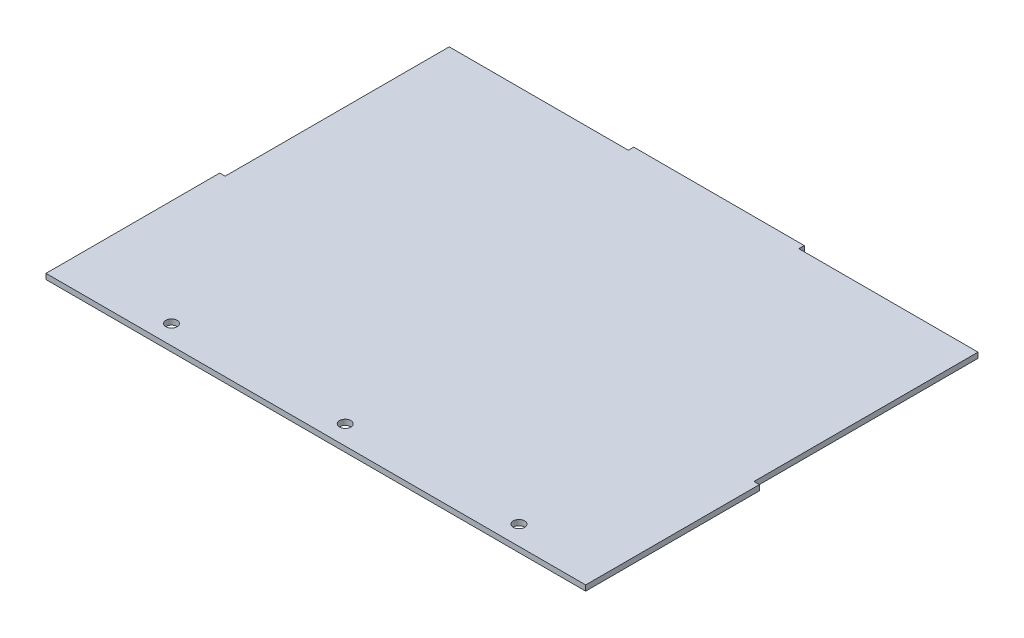
ISO-10303-21;
HEADER;
FILE_DESCRIPTION(('STEP AP214'),'2;1');
FILE_NAME('part.step','',(''),(''),'','','');
FILE_SCHEMA(('AUTOMOTIVE_DESIGN { 1 0 10303 214 1 1 1 1 }'));
ENDSEC;
DATA;
#1=APPLICATION_CONTEXT('core data for automotive mechanical design processes');
#2=APPLICATION_PROTOCOL_DEFINITION('international standard','automotive_design',2000,#1);
#3=PRODUCT_CONTEXT('',#1,'mechanical');
#4=PRODUCT('Part','Part','',(#3));
#5=PRODUCT_RELATED_PRODUCT_CATEGORY('part','',(#4));
#6=PRODUCT_DEFINITION_FORMATION('','',#4);
#7=PRODUCT_DEFINITION_CONTEXT('part definition',#1,'design');
#8=PRODUCT_DEFINITION('design','',#6,#7);
#9=PRODUCT_DEFINITION_SHAPE('','',#8);
#10=(LENGTH_UNIT() NAMED_UNIT(*) SI_UNIT(.MILLI.,.METRE.));
#11=(NAMED_UNIT(*) PLANE_ANGLE_UNIT() SI_UNIT($,.RADIAN.));
#12=(NAMED_UNIT(*) SI_UNIT($,.STERADIAN.) SOLID_ANGLE_UNIT());
#13=UNCERTAINTY_MEASURE_WITH_UNIT(LENGTH_MEASURE(1.E-05),#10,'distance_accuracy_value','');
#14=(GEOMETRIC_REPRESENTATION_CONTEXT(3) GLOBAL_UNCERTAINTY_ASSIGNED_CONTEXT((#13)) GLOBAL_UNIT_ASSIGNED_CONTEXT((#10,
#11,#12)) REPRESENTATION_CONTEXT('',''));
#15=CARTESIAN_POINT('',(0.,0.,0.));
#16=DIRECTION('',(0.,0.,1.));
#17=DIRECTION('',(1.,0.,0.));
#18=AXIS2_PLACEMENT_3D('',#15,#16,#17);
#19=CARTESIAN_POINT('',(0.,0.,0.));
#20=DIRECTION('',(0.,0.,-1.));
#21=DIRECTION('',(-1.,0.,0.));
#22=AXIS2_PLACEMENT_3D('',#19,#20,#21);
#23=PLANE('',#22);
#24=DIRECTION('',(0.,1.,0.));
#25=VECTOR('',#24,1.);
#26=CARTESIAN_POINT('',(-49.84,1.5875,0.));
#27=LINE('',#26,#25);
#28=CARTESIAN_POINT('',(-49.84,-1.5875,0.));
#29=VERTEX_POINT('',#28);
#30=CARTESIAN_POINT('',(-49.84,1.5875,0.));
#31=VERTEX_POINT('',#30);
#32=EDGE_CURVE('E53',#29,#31,#27,.T.);
#33=ORIENTED_EDGE('',*,*,#32,.F.);
#34=DIRECTION('',(1.,0.,0.));
#35=VECTOR('',#34,1.);
#36=CARTESIAN_POINT('',(-157.79,-1.5875,0.));
#37=LINE('',#36,#35);
#38=CARTESIAN_POINT('',(-154.615,-1.5875,0.));
#39=VERTEX_POINT('',#38);
#40=EDGE_CURVE('E208',#39,#29,#37,.T.);
#41=ORIENTED_EDGE('',*,*,#40,.F.);
#42=DIRECTION('',(0.,1.,0.));
#43=VECTOR('',#42,1.);
#44=CARTESIAN_POINT('',(-154.615,-1.5875,0.));
#45=LINE('',#44,#43);
#46=CARTESIAN_POINT('',(-154.615,1.5875,0.));
#47=VERTEX_POINT('',#46);
#48=EDGE_CURVE('E192',#39,#47,#45,.T.);
#49=ORIENTED_EDGE('',*,*,#48,.T.);
#50=DIRECTION('',(-1.,0.,0.));
#51=VECTOR('',#50,1.);
#52=CARTESIAN_POINT('',(-157.79,1.5875,0.));
#53=LINE('',#52,#51);
#54=EDGE_CURVE('E58',#31,#47,#53,.T.);
#55=ORIENTED_EDGE('',*,*,#54,.F.);
#56=EDGE_LOOP('',(#33,#41,#49,#55));
#57=FACE_BOUND('',#56,.T.);
#58=ADVANCED_FACE('F38',(#57),#23,.T.);
#59=CARTESIAN_POINT('',(-95.7046067812089,1.5875,221.308349999902));
#60=DIRECTION('',(0.,-1.,0.));
#61=DIRECTION('',(0.,0.,-1.));
#62=AXIS2_PLACEMENT_3D('',#59,#60,#61);
#63=CYLINDRICAL_SURFACE('',#62,3.302);
#64=CARTESIAN_POINT('',(-95.7046067812089,1.5875,221.308349999902));
#65=DIRECTION('',(0.,-1.,0.));
#66=DIRECTION('',(0.,0.,-1.));
#67=AXIS2_PLACEMENT_3D('',#64,#65,#66);
#68=CIRCLE('',#67,3.302);
#69=CARTESIAN_POINT('',(-95.7046067812089,1.5875,218.006349999902));
#70=VERTEX_POINT('',#69);
#71=EDGE_CURVE('E46',#70,#70,#68,.T.);
#72=ORIENTED_EDGE('',*,*,#71,.F.);
#73=EDGE_LOOP('',(#72));
#74=FACE_BOUND('',#73,.T.);
#75=CARTESIAN_POINT('',(-95.7046067812089,-1.5875,221.308349999902));
#76=DIRECTION('',(0.,-1.,0.));
#77=DIRECTION('',(0.,0.,-1.));
#78=AXIS2_PLACEMENT_3D('',#75,#76,#77);
#79=CIRCLE('',#78,3.302);
#80=CARTESIAN_POINT('',(-95.7046067812089,-1.5875,218.006349999902));
#81=VERTEX_POINT('',#80);
#82=EDGE_CURVE('E11',#81,#81,#79,.T.);
#83=ORIENTED_EDGE('',*,*,#82,.T.);
#84=EDGE_LOOP('',(#83));
#85=FACE_BOUND('',#84,.T.);
#86=ADVANCED_FACE('F40',(#74,#85),#63,.F.);
#87=CARTESIAN_POINT('',(157.79,-1.5875,232.600000128));
#88=DIRECTION('',(-1.,0.,0.));
#89=DIRECTION('',(0.,0.,1.));
#90=AXIS2_PLACEMENT_3D('',#87,#88,#89);
#91=PLANE('',#90);
#92=DIRECTION('',(0.,1.,0.));
#93=VECTOR('',#92,1.);
#94=CARTESIAN_POINT('',(157.79,-1.5875,130.999992));
#95=LINE('',#94,#93);
#96=CARTESIAN_POINT('',(157.79,-1.5875,130.999992));
#97=VERTEX_POINT('',#96);
#98=CARTESIAN_POINT('',(157.79,1.5875,130.999992));
#99=VERTEX_POINT('',#98);
#100=EDGE_CURVE('E174',#97,#99,#95,.T.);
#101=ORIENTED_EDGE('',*,*,#100,.T.);
#102=DIRECTION('',(0.,0.,-1.));
#103=VECTOR('',#102,1.);
#104=CARTESIAN_POINT('',(157.79,1.5875,232.600000128));
#105=LINE('',#104,#103);
#106=CARTESIAN_POINT('',(157.79,1.5875,232.600000128));
#107=VERTEX_POINT('',#106);
#108=EDGE_CURVE('E227',#107,#99,#105,.T.);
#109=ORIENTED_EDGE('',*,*,#108,.F.);
#110=DIRECTION('',(0.,1.,0.));
#111=VECTOR('',#110,1.);
#112=CARTESIAN_POINT('',(157.79,-1.5875,232.600000128));
#113=LINE('',#112,#111);
#114=CARTESIAN_POINT('',(157.79,-1.5875,232.600000128));
#115=VERTEX_POINT('',#114);
#116=EDGE_CURVE('E204',#115,#107,#113,.T.);
#117=ORIENTED_EDGE('',*,*,#116,.F.);
#118=DIRECTION('',(0.,0.,-1.));
#119=VECTOR('',#118,1.);
#120=CARTESIAN_POINT('',(157.79,-1.5875,232.600000128));
#121=LINE('',#120,#119);
#122=EDGE_CURVE('E214',#115,#97,#121,.T.);
#123=ORIENTED_EDGE('',*,*,#122,.T.);
#124=EDGE_LOOP('',(#101,#109,#117,#123));
#125=FACE_BOUND('',#124,.T.);
#126=ADVANCED_FACE('F234',(#125),#91,.F.);
#127=CARTESIAN_POINT('',(-157.79,1.5875,232.600000128));
#128=DIRECTION('',(0.,-1.,0.));
#129=DIRECTION('',(0.,0.,-1.));
#130=AXIS2_PLACEMENT_3D('',#127,#128,#129);
#131=PLANE('',#130);
#132=CARTESIAN_POINT('',(5.89539321879114,1.5875,221.308349999902));
#133=DIRECTION('',(0.,-1.,0.));
#134=DIRECTION('',(0.,0.,-1.));
#135=AXIS2_PLACEMENT_3D('',#132,#133,#134);
#136=CIRCLE('',#135,3.302);
#137=CARTESIAN_POINT('',(5.89539321879114,1.5875,218.006349999902));
#138=VERTEX_POINT('',#137);
#139=EDGE_CURVE('E151',#138,#138,#136,.T.);
#140=ORIENTED_EDGE('',*,*,#139,.T.);
#141=EDGE_LOOP('',(#140));
#142=FACE_BOUND('',#141,.T.);
#143=CARTESIAN_POINT('',(107.495393218791,1.5875,221.308349999902));
#144=DIRECTION('',(0.,-1.,0.));
#145=DIRECTION('',(0.,0.,-1.));
#146=AXIS2_PLACEMENT_3D('',#143,#144,#145);
#147=CIRCLE('',#146,3.302);
#148=CARTESIAN_POINT('',(107.495393218791,1.5875,218.006349999902));
#149=VERTEX_POINT('',#148);
#150=EDGE_CURVE('E163',#149,#149,#147,.T.);
#151=ORIENTED_EDGE('',*,*,#150,.T.);
#152=EDGE_LOOP('',(#151));
#153=FACE_BOUND('',#152,.T.);
#154=DIRECTION('',(1.,0.,0.));
#155=VECTOR('',#154,1.);
#156=CARTESIAN_POINT('',(-157.79,1.5875,130.999992));
#157=LINE('',#156,#155);
#158=CARTESIAN_POINT('',(154.615,1.5875,130.999992));
#159=VERTEX_POINT('',#158);
#160=EDGE_CURVE('E183',#159,#99,#157,.T.);
#161=ORIENTED_EDGE('',*,*,#160,.F.);
#162=DIRECTION('',(0.,0.,1.));
#163=VECTOR('',#162,1.);
#164=CARTESIAN_POINT('',(154.615,1.5875,232.600000128));
#165=LINE('',#164,#163);
#166=CARTESIAN_POINT('',(154.615,1.5875,0.));
#167=VERTEX_POINT('',#166);
#168=EDGE_CURVE('E177',#167,#159,#165,.T.);
#169=ORIENTED_EDGE('',*,*,#168,.F.);
#170=CARTESIAN_POINT('',(49.84,1.5875,0.));
#171=VERTEX_POINT('',#170);
#172=EDGE_CURVE('E215',#167,#171,#53,.T.);
#173=ORIENTED_EDGE('',*,*,#172,.T.);
#174=DIRECTION('',(0.,0.,1.));
#175=VECTOR('',#174,1.);
#176=CARTESIAN_POINT('',(49.84,1.5875,-3.175));
#177=LINE('',#176,#175);
#178=CARTESIAN_POINT('',(49.84,1.5875,-3.175));
#179=VERTEX_POINT('',#178);
#180=EDGE_CURVE('E135',#179,#171,#177,.T.);
#181=ORIENTED_EDGE('',*,*,#180,.F.);
#182=DIRECTION('',(1.,0.,0.));
#183=VECTOR('',#182,1.);
#184=CARTESIAN_POINT('',(-49.84,1.5875,-3.175));
#185=LINE('',#184,#183);
#186=CARTESIAN_POINT('',(-49.84,1.5875,-3.175));
#187=VERTEX_POINT('',#186);
#188=EDGE_CURVE('E126',#187,#179,#185,.T.);
#189=ORIENTED_EDGE('',*,*,#188,.F.);
#190=DIRECTION('',(0.,0.,1.));
#191=VECTOR('',#190,1.);
#192=CARTESIAN_POINT('',(-49.84,1.5875,-3.175));
#193=LINE('',#192,#191);
#194=EDGE_CURVE('E132',#187,#31,#193,.T.);
#195=ORIENTED_EDGE('',*,*,#194,.T.);
#196=ORIENTED_EDGE('',*,*,#54,.T.);
#197=DIRECTION('',(0.,0.,1.));
#198=VECTOR('',#197,1.);
#199=CARTESIAN_POINT('',(-154.615,1.5875,232.600000128));
#200=LINE('',#199,#198);
#201=CARTESIAN_POINT('',(-154.615,1.5875,130.999992));
#202=VERTEX_POINT('',#201);
#203=EDGE_CURVE('E194',#47,#202,#200,.T.);
#204=ORIENTED_EDGE('',*,*,#203,.T.);
#205=DIRECTION('',(-1.,0.,0.));
#206=VECTOR('',#205,1.);
#207=CARTESIAN_POINT('',(-157.79,1.5875,130.999992));
#208=LINE('',#207,#206);
#209=CARTESIAN_POINT('',(-157.79,1.5875,130.999992));
#210=VERTEX_POINT('',#209);
#211=EDGE_CURVE('E201',#202,#210,#208,.T.);
#212=ORIENTED_EDGE('',*,*,#211,.T.);
#213=DIRECTION('',(0.,0.,-1.));
#214=VECTOR('',#213,1.);
#215=CARTESIAN_POINT('',(-157.79,1.5875,232.600000128));
#216=LINE('',#215,#214);
#217=CARTESIAN_POINT('',(-157.79,1.5875,232.600000128));
#218=VERTEX_POINT('',#217);
#219=EDGE_CURVE('E224',#218,#210,#216,.T.);
#220=ORIENTED_EDGE('',*,*,#219,.F.);
#221=DIRECTION('',(-1.,0.,0.));
#222=VECTOR('',#221,1.);
#223=CARTESIAN_POINT('',(-157.79,1.5875,232.600000128));
#224=LINE('',#223,#222);
#225=EDGE_CURVE('E207',#107,#218,#224,.T.);
#226=ORIENTED_EDGE('',*,*,#225,.F.);
#227=ORIENTED_EDGE('',*,*,#108,.T.);
#228=EDGE_LOOP('',(#161,#169,#173,#181,#189,#195,#196,#204,#212,#220,#226,#227));
#229=FACE_BOUND('',#228,.T.);
#230=ORIENTED_EDGE('',*,*,#71,.T.);
#231=EDGE_LOOP('',(#230));
#232=FACE_BOUND('',#231,.T.);
#233=ADVANCED_FACE('F129',(#142,#153,#229,#232),#131,.F.);
#234=CARTESIAN_POINT('',(-157.79,-1.5875,232.600000128));
#235=DIRECTION('',(0.,1.,0.));
#236=DIRECTION('',(0.,0.,1.));
#237=AXIS2_PLACEMENT_3D('',#234,#235,#236);
#238=PLANE('',#237);
#239=CARTESIAN_POINT('',(5.89539321879114,-1.5875,221.308349999902));
#240=DIRECTION('',(0.,-1.,0.));
#241=DIRECTION('',(0.,0.,-1.));
#242=AXIS2_PLACEMENT_3D('',#239,#240,#241);
#243=CIRCLE('',#242,3.302);
#244=CARTESIAN_POINT('',(5.89539321879114,-1.5875,218.006349999902));
#245=VERTEX_POINT('',#244);
#246=EDGE_CURVE('E154',#245,#245,#243,.T.);
#247=ORIENTED_EDGE('',*,*,#246,.F.);
#248=EDGE_LOOP('',(#247));
#249=FACE_BOUND('',#248,.T.);
#250=CARTESIAN_POINT('',(107.495393218791,-1.5875,221.308349999902));
#251=DIRECTION('',(0.,-1.,0.));
#252=DIRECTION('',(0.,0.,-1.));
#253=AXIS2_PLACEMENT_3D('',#250,#251,#252);
#254=CIRCLE('',#253,3.302);
#255=CARTESIAN_POINT('',(107.495393218791,-1.5875,218.006349999902));
#256=VERTEX_POINT('',#255);
#257=EDGE_CURVE('E162',#256,#256,#254,.T.);
#258=ORIENTED_EDGE('',*,*,#257,.F.);
#259=EDGE_LOOP('',(#258));
#260=FACE_BOUND('',#259,.T.);
#261=DIRECTION('',(-1.,0.,0.));
#262=VECTOR('',#261,1.);
#263=CARTESIAN_POINT('',(157.79,-1.5875,130.999992));
#264=LINE('',#263,#262);
#265=CARTESIAN_POINT('',(154.615,-1.5875,130.999992));
#266=VERTEX_POINT('',#265);
#267=EDGE_CURVE('E171',#97,#266,#264,.T.);
#268=ORIENTED_EDGE('',*,*,#267,.F.);
#269=ORIENTED_EDGE('',*,*,#122,.F.);
#270=DIRECTION('',(1.,0.,0.));
#271=VECTOR('',#270,1.);
#272=CARTESIAN_POINT('',(-157.79,-1.5875,232.600000128));
#273=LINE('',#272,#271);
#274=CARTESIAN_POINT('',(-157.79,-1.5875,232.600000128));
#275=VERTEX_POINT('',#274);
#276=EDGE_CURVE('E212',#275,#115,#273,.T.);
#277=ORIENTED_EDGE('',*,*,#276,.F.);
#278=DIRECTION('',(0.,0.,-1.));
#279=VECTOR('',#278,1.);
#280=CARTESIAN_POINT('',(-157.79,-1.5875,232.600000128));
#281=LINE('',#280,#279);
#282=CARTESIAN_POINT('',(-157.79,-1.5875,130.999992));
#283=VERTEX_POINT('',#282);
#284=EDGE_CURVE('E221',#275,#283,#281,.T.);
#285=ORIENTED_EDGE('',*,*,#284,.T.);
#286=DIRECTION('',(1.,0.,0.));
#287=VECTOR('',#286,1.);
#288=CARTESIAN_POINT('',(-157.79,-1.5875,130.999992));
#289=LINE('',#288,#287);
#290=CARTESIAN_POINT('',(-154.615,-1.5875,130.999992));
#291=VERTEX_POINT('',#290);
#292=EDGE_CURVE('E185',#283,#291,#289,.T.);
#293=ORIENTED_EDGE('',*,*,#292,.T.);
#294=DIRECTION('',(0.,0.,-1.));
#295=VECTOR('',#294,1.);
#296=CARTESIAN_POINT('',(-154.615,-1.5875,0.));
#297=LINE('',#296,#295);
#298=EDGE_CURVE('E188',#291,#39,#297,.T.);
#299=ORIENTED_EDGE('',*,*,#298,.T.);
#300=ORIENTED_EDGE('',*,*,#40,.T.);
#301=DIRECTION('',(0.,0.,1.));
#302=VECTOR('',#301,1.);
#303=CARTESIAN_POINT('',(-49.84,-1.5875,-3.175));
#304=LINE('',#303,#302);
#305=CARTESIAN_POINT('',(-49.84,-1.5875,-3.175));
#306=VERTEX_POINT('',#305);
#307=EDGE_CURVE('E445',#306,#29,#304,.T.);
#308=ORIENTED_EDGE('',*,*,#307,.F.);
#309=DIRECTION('',(-1.,0.,0.));
#310=VECTOR('',#309,1.);
#311=CARTESIAN_POINT('',(-49.84,-1.5875,-3.175));
#312=LINE('',#311,#310);
#313=CARTESIAN_POINT('',(49.84,-1.5875,-3.175));
#314=VERTEX_POINT('',#313);
#315=EDGE_CURVE('E144',#314,#306,#312,.T.);
#316=ORIENTED_EDGE('',*,*,#315,.F.);
#317=DIRECTION('',(0.,0.,1.));
#318=VECTOR('',#317,1.);
#319=CARTESIAN_POINT('',(49.84,-1.5875,-3.175));
#320=LINE('',#319,#318);
#321=CARTESIAN_POINT('',(49.84,-1.5875,0.));
#322=VERTEX_POINT('',#321);
#323=EDGE_CURVE('E156',#314,#322,#320,.T.);
#324=ORIENTED_EDGE('',*,*,#323,.T.);
#325=CARTESIAN_POINT('',(154.615,-1.5875,0.));
#326=VERTEX_POINT('',#325);
#327=EDGE_CURVE('E217',#322,#326,#37,.T.);
#328=ORIENTED_EDGE('',*,*,#327,.T.);
#329=DIRECTION('',(0.,0.,-1.));
#330=VECTOR('',#329,1.);
#331=CARTESIAN_POINT('',(154.615,-1.5875,0.));
#332=LINE('',#331,#330);
#333=EDGE_CURVE('E166',#266,#326,#332,.T.);
#334=ORIENTED_EDGE('',*,*,#333,.F.);
#335=EDGE_LOOP('',(#268,#269,#277,#285,#293,#299,#300,#308,#316,#324,#328,#334));
#336=FACE_BOUND('',#335,.T.);
#337=ORIENTED_EDGE('',*,*,#82,.F.);
#338=EDGE_LOOP('',(#337));
#339=FACE_BOUND('',#338,.T.);
#340=ADVANCED_FACE('F237',(#249,#260,#336,#339),#238,.F.);
#341=DIRECTION('',(0.,-1.,0.));
#342=VECTOR('',#341,1.);
#343=CARTESIAN_POINT('',(49.84,1.5875,0.));
#344=LINE('',#343,#342);
#345=EDGE_CURVE('E148',#171,#322,#344,.T.);
#346=ORIENTED_EDGE('',*,*,#345,.F.);
#347=ORIENTED_EDGE('',*,*,#172,.F.);
#348=DIRECTION('',(0.,1.,0.));
#349=VECTOR('',#348,1.);
#350=CARTESIAN_POINT('',(154.615,-1.5875,0.));
#351=LINE('',#350,#349);
#352=EDGE_CURVE('E173',#326,#167,#351,.T.);
#353=ORIENTED_EDGE('',*,*,#352,.F.);
#354=ORIENTED_EDGE('',*,*,#327,.F.);
#355=EDGE_LOOP('',(#346,#347,#353,#354));
#356=FACE_BOUND('',#355,.T.);
#357=ADVANCED_FACE('F239',(#356),#23,.T.);
#358=CARTESIAN_POINT('',(-157.79,-1.5875,232.600000128));
#359=DIRECTION('',(1.,0.,0.));
#360=DIRECTION('',(0.,0.,-1.));
#361=AXIS2_PLACEMENT_3D('',#358,#359,#360);
#362=PLANE('',#361);
#363=ORIENTED_EDGE('',*,*,#219,.T.);
#364=DIRECTION('',(0.,1.,0.));
#365=VECTOR('',#364,1.);
#366=CARTESIAN_POINT('',(-157.79,-1.5875,130.999992));
#367=LINE('',#366,#365);
#368=EDGE_CURVE('E191',#283,#210,#367,.T.);
#369=ORIENTED_EDGE('',*,*,#368,.F.);
#370=ORIENTED_EDGE('',*,*,#284,.F.);
#371=DIRECTION('',(0.,-1.,0.));
#372=VECTOR('',#371,1.);
#373=CARTESIAN_POINT('',(-157.79,-1.5875,232.600000128));
#374=LINE('',#373,#372);
#375=EDGE_CURVE('E210',#218,#275,#374,.T.);
#376=ORIENTED_EDGE('',*,*,#375,.F.);
#377=EDGE_LOOP('',(#363,#369,#370,#376));
#378=FACE_BOUND('',#377,.T.);
#379=ADVANCED_FACE('F246',(#378),#362,.F.);
#380=CARTESIAN_POINT('',(0.,0.,232.600000128));
#381=DIRECTION('',(0.,0.,-1.));
#382=DIRECTION('',(-1.,0.,0.));
#383=AXIS2_PLACEMENT_3D('',#380,#381,#382);
#384=PLANE('',#383);
#385=ORIENTED_EDGE('',*,*,#116,.T.);
#386=ORIENTED_EDGE('',*,*,#225,.T.);
#387=ORIENTED_EDGE('',*,*,#375,.T.);
#388=ORIENTED_EDGE('',*,*,#276,.T.);
#389=EDGE_LOOP('',(#385,#386,#387,#388));
#390=FACE_BOUND('',#389,.T.);
#391=ADVANCED_FACE('F258',(#390),#384,.F.);
#392=CARTESIAN_POINT('',(-157.79,-1.5875,130.999992));
#393=DIRECTION('',(0.,0.,1.));
#394=DIRECTION('',(1.,0.,0.));
#395=AXIS2_PLACEMENT_3D('',#392,#393,#394);
#396=PLANE('',#395);
#397=DIRECTION('',(0.,1.,0.));
#398=VECTOR('',#397,1.);
#399=CARTESIAN_POINT('',(-154.615,-1.5875,130.999992));
#400=LINE('',#399,#398);
#401=EDGE_CURVE('E195',#291,#202,#400,.T.);
#402=ORIENTED_EDGE('',*,*,#401,.F.);
#403=ORIENTED_EDGE('',*,*,#292,.F.);
#404=ORIENTED_EDGE('',*,*,#368,.T.);
#405=ORIENTED_EDGE('',*,*,#211,.F.);
#406=EDGE_LOOP('',(#402,#403,#404,#405));
#407=FACE_BOUND('',#406,.T.);
#408=ADVANCED_FACE('F261',(#407),#396,.F.);
#409=CARTESIAN_POINT('',(-154.615,-1.5875,0.));
#410=DIRECTION('',(1.,0.,0.));
#411=DIRECTION('',(0.,0.,-1.));
#412=AXIS2_PLACEMENT_3D('',#409,#410,#411);
#413=PLANE('',#412);
#414=ORIENTED_EDGE('',*,*,#48,.F.);
#415=ORIENTED_EDGE('',*,*,#298,.F.);
#416=ORIENTED_EDGE('',*,*,#401,.T.);
#417=ORIENTED_EDGE('',*,*,#203,.F.);
#418=EDGE_LOOP('',(#414,#415,#416,#417));
#419=FACE_BOUND('',#418,.T.);
#420=ADVANCED_FACE('F265',(#419),#413,.F.);
#421=CARTESIAN_POINT('',(157.79,-1.5875,130.999992));
#422=DIRECTION('',(0.,0.,-1.));
#423=DIRECTION('',(-1.,0.,0.));
#424=AXIS2_PLACEMENT_3D('',#421,#422,#423);
#425=PLANE('',#424);
#426=ORIENTED_EDGE('',*,*,#160,.T.);
#427=ORIENTED_EDGE('',*,*,#100,.F.);
#428=ORIENTED_EDGE('',*,*,#267,.T.);
#429=DIRECTION('',(0.,1.,0.));
#430=VECTOR('',#429,1.);
#431=CARTESIAN_POINT('',(154.615,-1.5875,130.999992));
#432=LINE('',#431,#430);
#433=EDGE_CURVE('E178',#266,#159,#432,.T.);
#434=ORIENTED_EDGE('',*,*,#433,.T.);
#435=EDGE_LOOP('',(#426,#427,#428,#434));
#436=FACE_BOUND('',#435,.T.);
#437=ADVANCED_FACE('F269',(#436),#425,.T.);
#438=CARTESIAN_POINT('',(154.615,-1.5875,0.));
#439=DIRECTION('',(1.,0.,0.));
#440=DIRECTION('',(0.,0.,-1.));
#441=AXIS2_PLACEMENT_3D('',#438,#439,#440);
#442=PLANE('',#441);
#443=ORIENTED_EDGE('',*,*,#168,.T.);
#444=ORIENTED_EDGE('',*,*,#433,.F.);
#445=ORIENTED_EDGE('',*,*,#333,.T.);
#446=ORIENTED_EDGE('',*,*,#352,.T.);
#447=EDGE_LOOP('',(#443,#444,#445,#446));
#448=FACE_BOUND('',#447,.T.);
#449=ADVANCED_FACE('F271',(#448),#442,.T.);
#450=CARTESIAN_POINT('',(107.495393218791,1.5875,221.308349999902));
#451=DIRECTION('',(0.,-1.,0.));
#452=DIRECTION('',(0.,0.,-1.));
#453=AXIS2_PLACEMENT_3D('',#450,#451,#452);
#454=CYLINDRICAL_SURFACE('',#453,3.302);
#455=ORIENTED_EDGE('',*,*,#150,.F.);
#456=EDGE_LOOP('',(#455));
#457=FACE_BOUND('',#456,.T.);
#458=ORIENTED_EDGE('',*,*,#257,.T.);
#459=EDGE_LOOP('',(#458));
#460=FACE_BOUND('',#459,.T.);
#461=ADVANCED_FACE('F274',(#457,#460),#454,.F.);
#462=CARTESIAN_POINT('',(5.89539321879114,1.5875,221.308349999902));
#463=DIRECTION('',(0.,-1.,0.));
#464=DIRECTION('',(0.,0.,-1.));
#465=AXIS2_PLACEMENT_3D('',#462,#463,#464);
#466=CYLINDRICAL_SURFACE('',#465,3.302);
#467=ORIENTED_EDGE('',*,*,#139,.F.);
#468=EDGE_LOOP('',(#467));
#469=FACE_BOUND('',#468,.T.);
#470=ORIENTED_EDGE('',*,*,#246,.T.);
#471=EDGE_LOOP('',(#470));
#472=FACE_BOUND('',#471,.T.);
#473=ADVANCED_FACE('F281',(#469,#472),#466,.F.);
#474=CARTESIAN_POINT('',(-49.84,1.5875,-3.175));
#475=DIRECTION('',(1.,0.,0.));
#476=DIRECTION('',(0.,0.,-1.));
#477=AXIS2_PLACEMENT_3D('',#474,#475,#476);
#478=PLANE('',#477);
#479=ORIENTED_EDGE('',*,*,#32,.T.);
#480=ORIENTED_EDGE('',*,*,#194,.F.);
#481=DIRECTION('',(0.,1.,0.));
#482=VECTOR('',#481,1.);
#483=CARTESIAN_POINT('',(-49.84,1.5875,-3.175));
#484=LINE('',#483,#482);
#485=EDGE_CURVE('E139',#306,#187,#484,.T.);
#486=ORIENTED_EDGE('',*,*,#485,.F.);
#487=ORIENTED_EDGE('',*,*,#307,.T.);
#488=EDGE_LOOP('',(#479,#480,#486,#487));
#489=FACE_BOUND('',#488,.T.);
#490=ADVANCED_FACE('F150',(#489),#478,.F.);
#491=CARTESIAN_POINT('',(49.84,1.5875,-3.175));
#492=DIRECTION('',(-1.,0.,0.));
#493=DIRECTION('',(0.,0.,1.));
#494=AXIS2_PLACEMENT_3D('',#491,#492,#493);
#495=PLANE('',#494);
#496=ORIENTED_EDGE('',*,*,#345,.T.);
#497=ORIENTED_EDGE('',*,*,#323,.F.);
#498=DIRECTION('',(0.,-1.,0.));
#499=VECTOR('',#498,1.);
#500=CARTESIAN_POINT('',(49.84,1.5875,-3.175));
#501=LINE('',#500,#499);
#502=EDGE_CURVE('E138',#179,#314,#501,.T.);
#503=ORIENTED_EDGE('',*,*,#502,.F.);
#504=ORIENTED_EDGE('',*,*,#180,.T.);
#505=EDGE_LOOP('',(#496,#497,#503,#504));
#506=FACE_BOUND('',#505,.T.);
#507=ADVANCED_FACE('F288',(#506),#495,.F.);
#508=CARTESIAN_POINT('',(0.,0.,-3.175));
#509=DIRECTION('',(0.,0.,1.));
#510=DIRECTION('',(1.,0.,0.));
#511=AXIS2_PLACEMENT_3D('',#508,#509,#510);
#512=PLANE('',#511);
#513=ORIENTED_EDGE('',*,*,#485,.T.);
#514=ORIENTED_EDGE('',*,*,#188,.T.);
#515=ORIENTED_EDGE('',*,*,#502,.T.);
#516=ORIENTED_EDGE('',*,*,#315,.T.);
#517=EDGE_LOOP('',(#513,#514,#515,#516));
#518=FACE_BOUND('',#517,.T.);
#519=ADVANCED_FACE('F142',(#518),#512,.F.);
#520=CLOSED_SHELL('',(#58,#86,#126,#233,#340,#357,#379,#391,#408,#420,#437,#449,#461,#473,#490,
#507,#519));
#521=MANIFOLD_SOLID_BREP('B2',#520);
#522=ADVANCED_BREP_SHAPE_REPRESENTATION('',(#18,#521),#14);
#523=SHAPE_DEFINITION_REPRESENTATION(#9,#522);
ENDSEC;
END-ISO-10303-21;
